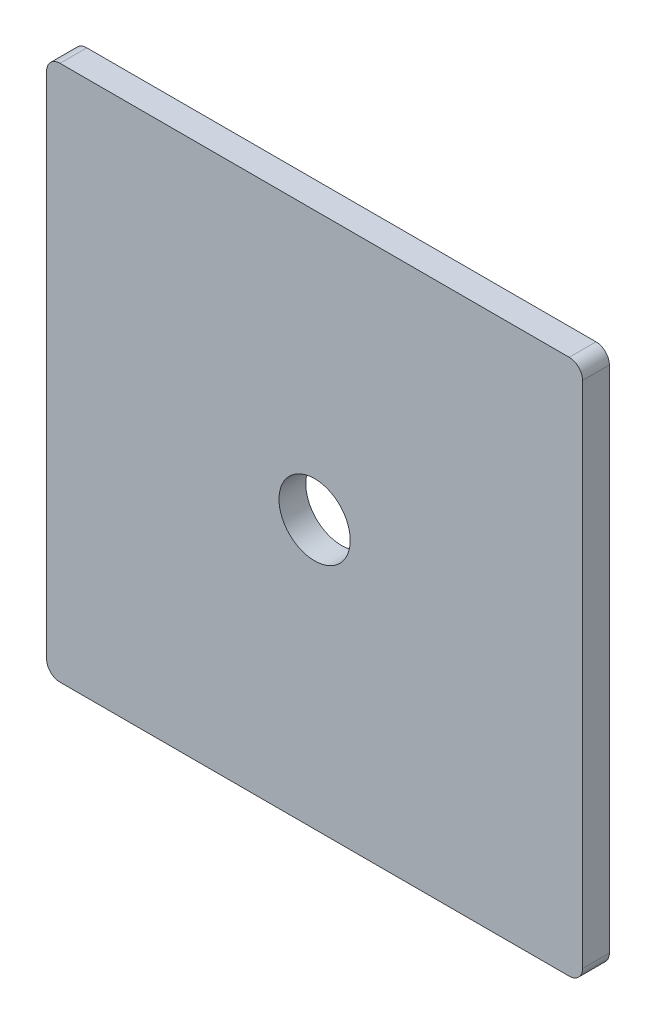
ISO-10303-21;
HEADER;
FILE_DESCRIPTION(('STEP AP214'),'2;1');
FILE_NAME('part.step','',(''),(''),'','','');
FILE_SCHEMA(('AUTOMOTIVE_DESIGN { 1 0 10303 214 1 1 1 1 }'));
ENDSEC;
DATA;
#1=APPLICATION_CONTEXT('core data for automotive mechanical design processes');
#2=APPLICATION_PROTOCOL_DEFINITION('international standard','automotive_design',2000,#1);
#3=PRODUCT_CONTEXT('',#1,'mechanical');
#4=PRODUCT('Part','Part','',(#3));
#5=PRODUCT_RELATED_PRODUCT_CATEGORY('part','',(#4));
#6=PRODUCT_DEFINITION_FORMATION('','',#4);
#7=PRODUCT_DEFINITION_CONTEXT('part definition',#1,'design');
#8=PRODUCT_DEFINITION('design','',#6,#7);
#9=PRODUCT_DEFINITION_SHAPE('','',#8);
#10=(LENGTH_UNIT() NAMED_UNIT(*) SI_UNIT(.MILLI.,.METRE.));
#11=(NAMED_UNIT(*) PLANE_ANGLE_UNIT() SI_UNIT($,.RADIAN.));
#12=(NAMED_UNIT(*) SI_UNIT($,.STERADIAN.) SOLID_ANGLE_UNIT());
#13=UNCERTAINTY_MEASURE_WITH_UNIT(LENGTH_MEASURE(1.E-05),#10,'distance_accuracy_value','');
#14=(GEOMETRIC_REPRESENTATION_CONTEXT(3) GLOBAL_UNCERTAINTY_ASSIGNED_CONTEXT((#13)) GLOBAL_UNIT_ASSIGNED_CONTEXT((#10,
#11,#12)) REPRESENTATION_CONTEXT('',''));
#15=CARTESIAN_POINT('',(0.,0.,0.));
#16=DIRECTION('',(0.,0.,1.));
#17=DIRECTION('',(1.,0.,0.));
#18=AXIS2_PLACEMENT_3D('',#15,#16,#17);
#19=CARTESIAN_POINT('',(2.85,-2.85,3.45));
#20=DIRECTION('',(0.,0.,-1.));
#21=DIRECTION('',(-1.,0.,0.));
#22=AXIS2_PLACEMENT_3D('',#19,#20,#21);
#23=CYLINDRICAL_SURFACE('',#22,0.15);
#24=CARTESIAN_POINT('',(2.85,-2.85,3.15));
#25=DIRECTION('',(0.,0.,-1.));
#26=DIRECTION('',(-1.,0.,0.));
#27=AXIS2_PLACEMENT_3D('',#24,#25,#26);
#28=CIRCLE('',#27,0.15);
#29=CARTESIAN_POINT('',(3.,-2.85,3.15));
#30=VERTEX_POINT('',#29);
#31=CARTESIAN_POINT('',(2.85,-3.,3.15));
#32=VERTEX_POINT('',#31);
#33=EDGE_CURVE('E134',#30,#32,#28,.T.);
#34=ORIENTED_EDGE('',*,*,#33,.F.);
#35=DIRECTION('',(0.,0.,-1.));
#36=VECTOR('',#35,1.);
#37=CARTESIAN_POINT('',(3.,-2.85,3.45));
#38=LINE('',#37,#36);
#39=CARTESIAN_POINT('',(3.,-2.85,3.45));
#40=VERTEX_POINT('',#39);
#41=EDGE_CURVE('E11',#40,#30,#38,.T.);
#42=ORIENTED_EDGE('',*,*,#41,.F.);
#43=CARTESIAN_POINT('',(2.85,-2.85,3.45));
#44=DIRECTION('',(0.,0.,-1.));
#45=DIRECTION('',(-1.,0.,0.));
#46=AXIS2_PLACEMENT_3D('',#43,#44,#45);
#47=CIRCLE('',#46,0.15);
#48=CARTESIAN_POINT('',(2.85,-3.,3.45));
#49=VERTEX_POINT('',#48);
#50=EDGE_CURVE('E154',#40,#49,#47,.T.);
#51=ORIENTED_EDGE('',*,*,#50,.T.);
#52=DIRECTION('',(0.,0.,-1.));
#53=VECTOR('',#52,1.);
#54=CARTESIAN_POINT('',(2.85,-3.,3.45));
#55=LINE('',#54,#53);
#56=EDGE_CURVE('E92',#49,#32,#55,.T.);
#57=ORIENTED_EDGE('',*,*,#56,.T.);
#58=EDGE_LOOP('',(#34,#42,#51,#57));
#59=FACE_BOUND('',#58,.T.);
#60=ADVANCED_FACE('F36',(#59),#23,.T.);
#61=CARTESIAN_POINT('',(3.,2.85,3.45));
#62=DIRECTION('',(1.,0.,0.));
#63=DIRECTION('',(0.,0.,-1.));
#64=AXIS2_PLACEMENT_3D('',#61,#62,#63);
#65=PLANE('',#64);
#66=DIRECTION('',(0.,-1.,0.));
#67=VECTOR('',#66,1.);
#68=CARTESIAN_POINT('',(3.,2.85,3.15));
#69=LINE('',#68,#67);
#70=CARTESIAN_POINT('',(3.,2.85,3.15));
#71=VERTEX_POINT('',#70);
#72=EDGE_CURVE('E152',#71,#30,#69,.T.);
#73=ORIENTED_EDGE('',*,*,#72,.F.);
#74=DIRECTION('',(0.,0.,-1.));
#75=VECTOR('',#74,1.);
#76=CARTESIAN_POINT('',(3.,2.85,3.45));
#77=LINE('',#76,#75);
#78=CARTESIAN_POINT('',(3.,2.85,3.45));
#79=VERTEX_POINT('',#78);
#80=EDGE_CURVE('E45',#79,#71,#77,.T.);
#81=ORIENTED_EDGE('',*,*,#80,.F.);
#82=DIRECTION('',(0.,-1.,0.));
#83=VECTOR('',#82,1.);
#84=CARTESIAN_POINT('',(3.,2.85,3.45));
#85=LINE('',#84,#83);
#86=EDGE_CURVE('E124',#79,#40,#85,.T.);
#87=ORIENTED_EDGE('',*,*,#86,.T.);
#88=ORIENTED_EDGE('',*,*,#41,.T.);
#89=EDGE_LOOP('',(#73,#81,#87,#88));
#90=FACE_BOUND('',#89,.T.);
#91=ADVANCED_FACE('F167',(#90),#65,.T.);
#92=CARTESIAN_POINT('',(2.85,2.85,3.45));
#93=DIRECTION('',(0.,0.,-1.));
#94=DIRECTION('',(-1.,0.,0.));
#95=AXIS2_PLACEMENT_3D('',#92,#93,#94);
#96=CYLINDRICAL_SURFACE('',#95,0.15);
#97=CARTESIAN_POINT('',(2.85,2.85,3.15));
#98=DIRECTION('',(0.,0.,-1.));
#99=DIRECTION('',(-1.,0.,0.));
#100=AXIS2_PLACEMENT_3D('',#97,#98,#99);
#101=CIRCLE('',#100,0.15);
#102=CARTESIAN_POINT('',(2.85,3.,3.15));
#103=VERTEX_POINT('',#102);
#104=EDGE_CURVE('E111',#103,#71,#101,.T.);
#105=ORIENTED_EDGE('',*,*,#104,.F.);
#106=DIRECTION('',(0.,0.,-1.));
#107=VECTOR('',#106,1.);
#108=CARTESIAN_POINT('',(2.85,3.,3.45));
#109=LINE('',#108,#107);
#110=CARTESIAN_POINT('',(2.85,3.,3.45));
#111=VERTEX_POINT('',#110);
#112=EDGE_CURVE('E106',#111,#103,#109,.T.);
#113=ORIENTED_EDGE('',*,*,#112,.F.);
#114=CARTESIAN_POINT('',(2.85,2.85,3.45));
#115=DIRECTION('',(0.,0.,-1.));
#116=DIRECTION('',(-1.,0.,0.));
#117=AXIS2_PLACEMENT_3D('',#114,#115,#116);
#118=CIRCLE('',#117,0.15);
#119=EDGE_CURVE('E109',#111,#79,#118,.T.);
#120=ORIENTED_EDGE('',*,*,#119,.T.);
#121=ORIENTED_EDGE('',*,*,#80,.T.);
#122=EDGE_LOOP('',(#105,#113,#120,#121));
#123=FACE_BOUND('',#122,.T.);
#124=ADVANCED_FACE('F108',(#123),#96,.T.);
#125=CARTESIAN_POINT('',(-2.85,3.,3.45));
#126=DIRECTION('',(0.,1.,0.));
#127=DIRECTION('',(0.,0.,1.));
#128=AXIS2_PLACEMENT_3D('',#125,#126,#127);
#129=PLANE('',#128);
#130=DIRECTION('',(1.,0.,0.));
#131=VECTOR('',#130,1.);
#132=CARTESIAN_POINT('',(-2.85,3.,3.15));
#133=LINE('',#132,#131);
#134=CARTESIAN_POINT('',(-2.85,3.,3.15));
#135=VERTEX_POINT('',#134);
#136=EDGE_CURVE('E149',#135,#103,#133,.T.);
#137=ORIENTED_EDGE('',*,*,#136,.F.);
#138=DIRECTION('',(0.,0.,-1.));
#139=VECTOR('',#138,1.);
#140=CARTESIAN_POINT('',(-2.85,3.,3.45));
#141=LINE('',#140,#139);
#142=CARTESIAN_POINT('',(-2.85,3.,3.45));
#143=VERTEX_POINT('',#142);
#144=EDGE_CURVE('E116',#143,#135,#141,.T.);
#145=ORIENTED_EDGE('',*,*,#144,.F.);
#146=DIRECTION('',(1.,0.,0.));
#147=VECTOR('',#146,1.);
#148=CARTESIAN_POINT('',(-2.85,3.,3.45));
#149=LINE('',#148,#147);
#150=EDGE_CURVE('E122',#143,#111,#149,.T.);
#151=ORIENTED_EDGE('',*,*,#150,.T.);
#152=ORIENTED_EDGE('',*,*,#112,.T.);
#153=EDGE_LOOP('',(#137,#145,#151,#152));
#154=FACE_BOUND('',#153,.T.);
#155=ADVANCED_FACE('F126',(#154),#129,.T.);
#156=CARTESIAN_POINT('',(-2.85,2.85,3.45));
#157=DIRECTION('',(0.,0.,-1.));
#158=DIRECTION('',(-1.,0.,0.));
#159=AXIS2_PLACEMENT_3D('',#156,#157,#158);
#160=CYLINDRICAL_SURFACE('',#159,0.15);
#161=CARTESIAN_POINT('',(-2.85,2.85,3.15));
#162=DIRECTION('',(0.,0.,-1.));
#163=DIRECTION('',(-1.,0.,0.));
#164=AXIS2_PLACEMENT_3D('',#161,#162,#163);
#165=CIRCLE('',#164,0.15);
#166=CARTESIAN_POINT('',(-3.,2.85,3.15));
#167=VERTEX_POINT('',#166);
#168=EDGE_CURVE('E146',#167,#135,#165,.T.);
#169=ORIENTED_EDGE('',*,*,#168,.F.);
#170=DIRECTION('',(0.,0.,-1.));
#171=VECTOR('',#170,1.);
#172=CARTESIAN_POINT('',(-3.,2.85,3.45));
#173=LINE('',#172,#171);
#174=CARTESIAN_POINT('',(-3.,2.85,3.45));
#175=VERTEX_POINT('',#174);
#176=EDGE_CURVE('E158',#175,#167,#173,.T.);
#177=ORIENTED_EDGE('',*,*,#176,.F.);
#178=CARTESIAN_POINT('',(-2.85,2.85,3.45));
#179=DIRECTION('',(0.,0.,-1.));
#180=DIRECTION('',(-1.,0.,0.));
#181=AXIS2_PLACEMENT_3D('',#178,#179,#180);
#182=CIRCLE('',#181,0.15);
#183=EDGE_CURVE('E127',#175,#143,#182,.T.);
#184=ORIENTED_EDGE('',*,*,#183,.T.);
#185=ORIENTED_EDGE('',*,*,#144,.T.);
#186=EDGE_LOOP('',(#169,#177,#184,#185));
#187=FACE_BOUND('',#186,.T.);
#188=ADVANCED_FACE('F180',(#187),#160,.T.);
#189=CARTESIAN_POINT('',(-3.,-2.85,3.45));
#190=DIRECTION('',(-1.,0.,0.));
#191=DIRECTION('',(0.,0.,1.));
#192=AXIS2_PLACEMENT_3D('',#189,#190,#191);
#193=PLANE('',#192);
#194=DIRECTION('',(0.,1.,0.));
#195=VECTOR('',#194,1.);
#196=CARTESIAN_POINT('',(-3.,-2.85,3.15));
#197=LINE('',#196,#195);
#198=CARTESIAN_POINT('',(-3.,-2.85,3.15));
#199=VERTEX_POINT('',#198);
#200=EDGE_CURVE('E143',#199,#167,#197,.T.);
#201=ORIENTED_EDGE('',*,*,#200,.F.);
#202=DIRECTION('',(0.,0.,-1.));
#203=VECTOR('',#202,1.);
#204=CARTESIAN_POINT('',(-3.,-2.85,3.45));
#205=LINE('',#204,#203);
#206=CARTESIAN_POINT('',(-3.,-2.85,3.45));
#207=VERTEX_POINT('',#206);
#208=EDGE_CURVE('E160',#207,#199,#205,.T.);
#209=ORIENTED_EDGE('',*,*,#208,.F.);
#210=DIRECTION('',(0.,1.,0.));
#211=VECTOR('',#210,1.);
#212=CARTESIAN_POINT('',(-3.,-2.85,3.45));
#213=LINE('',#212,#211);
#214=EDGE_CURVE('E129',#207,#175,#213,.T.);
#215=ORIENTED_EDGE('',*,*,#214,.T.);
#216=ORIENTED_EDGE('',*,*,#176,.T.);
#217=EDGE_LOOP('',(#201,#209,#215,#216));
#218=FACE_BOUND('',#217,.T.);
#219=ADVANCED_FACE('F183',(#218),#193,.T.);
#220=CARTESIAN_POINT('',(-2.85,-2.85,3.45));
#221=DIRECTION('',(0.,0.,-1.));
#222=DIRECTION('',(-1.,0.,0.));
#223=AXIS2_PLACEMENT_3D('',#220,#221,#222);
#224=CYLINDRICAL_SURFACE('',#223,0.15);
#225=CARTESIAN_POINT('',(-2.85,-2.85,3.15));
#226=DIRECTION('',(0.,0.,-1.));
#227=DIRECTION('',(-1.,0.,0.));
#228=AXIS2_PLACEMENT_3D('',#225,#226,#227);
#229=CIRCLE('',#228,0.15);
#230=CARTESIAN_POINT('',(-2.85,-3.,3.15));
#231=VERTEX_POINT('',#230);
#232=EDGE_CURVE('E140',#231,#199,#229,.T.);
#233=ORIENTED_EDGE('',*,*,#232,.F.);
#234=DIRECTION('',(0.,0.,-1.));
#235=VECTOR('',#234,1.);
#236=CARTESIAN_POINT('',(-2.85,-3.,3.45));
#237=LINE('',#236,#235);
#238=CARTESIAN_POINT('',(-2.85,-3.,3.45));
#239=VERTEX_POINT('',#238);
#240=EDGE_CURVE('E162',#239,#231,#237,.T.);
#241=ORIENTED_EDGE('',*,*,#240,.F.);
#242=CARTESIAN_POINT('',(-2.85,-2.85,3.45));
#243=DIRECTION('',(0.,0.,-1.));
#244=DIRECTION('',(-1.,0.,0.));
#245=AXIS2_PLACEMENT_3D('',#242,#243,#244);
#246=CIRCLE('',#245,0.15);
#247=EDGE_CURVE('E217',#239,#207,#246,.T.);
#248=ORIENTED_EDGE('',*,*,#247,.T.);
#249=ORIENTED_EDGE('',*,*,#208,.T.);
#250=EDGE_LOOP('',(#233,#241,#248,#249));
#251=FACE_BOUND('',#250,.T.);
#252=ADVANCED_FACE('F187',(#251),#224,.T.);
#253=CARTESIAN_POINT('',(2.85,-3.,3.45));
#254=DIRECTION('',(0.,-1.,0.));
#255=DIRECTION('',(0.,0.,-1.));
#256=AXIS2_PLACEMENT_3D('',#253,#254,#255);
#257=PLANE('',#256);
#258=DIRECTION('',(-1.,0.,0.));
#259=VECTOR('',#258,1.);
#260=CARTESIAN_POINT('',(2.85,-3.,3.15));
#261=LINE('',#260,#259);
#262=EDGE_CURVE('E137',#32,#231,#261,.T.);
#263=ORIENTED_EDGE('',*,*,#262,.F.);
#264=ORIENTED_EDGE('',*,*,#56,.F.);
#265=DIRECTION('',(-1.,0.,0.));
#266=VECTOR('',#265,1.);
#267=CARTESIAN_POINT('',(2.85,-3.,3.45));
#268=LINE('',#267,#266);
#269=EDGE_CURVE('E215',#49,#239,#268,.T.);
#270=ORIENTED_EDGE('',*,*,#269,.T.);
#271=ORIENTED_EDGE('',*,*,#240,.T.);
#272=EDGE_LOOP('',(#263,#264,#270,#271));
#273=FACE_BOUND('',#272,.T.);
#274=ADVANCED_FACE('F163',(#273),#257,.T.);
#275=CARTESIAN_POINT('',(2.85,-2.85,3.45));
#276=DIRECTION('',(0.,0.,-1.));
#277=DIRECTION('',(-1.,0.,0.));
#278=AXIS2_PLACEMENT_3D('',#275,#276,#277);
#279=PLANE('',#278);
#280=CARTESIAN_POINT('',(0.,0.,3.45));
#281=DIRECTION('',(0.,0.,1.));
#282=DIRECTION('',(1.,0.,0.));
#283=AXIS2_PLACEMENT_3D('',#280,#281,#282);
#284=CIRCLE('',#283,0.39883196395356);
#285=CARTESIAN_POINT('',(0.39883196395356,0.,3.45));
#286=VERTEX_POINT('',#285);
#287=EDGE_CURVE('E211',#286,#286,#284,.T.);
#288=ORIENTED_EDGE('',*,*,#287,.F.);
#289=EDGE_LOOP('',(#288));
#290=FACE_BOUND('',#289,.T.);
#291=ORIENTED_EDGE('',*,*,#50,.F.);
#292=ORIENTED_EDGE('',*,*,#86,.F.);
#293=ORIENTED_EDGE('',*,*,#119,.F.);
#294=ORIENTED_EDGE('',*,*,#150,.F.);
#295=ORIENTED_EDGE('',*,*,#183,.F.);
#296=ORIENTED_EDGE('',*,*,#214,.F.);
#297=ORIENTED_EDGE('',*,*,#247,.F.);
#298=ORIENTED_EDGE('',*,*,#269,.F.);
#299=EDGE_LOOP('',(#291,#292,#293,#294,#295,#296,#297,#298));
#300=FACE_BOUND('',#299,.T.);
#301=ADVANCED_FACE('F120',(#290,#300),#279,.F.);
#302=CARTESIAN_POINT('',(2.85,-2.85,3.15));
#303=DIRECTION('',(0.,0.,-1.));
#304=DIRECTION('',(-1.,0.,0.));
#305=AXIS2_PLACEMENT_3D('',#302,#303,#304);
#306=PLANE('',#305);
#307=CARTESIAN_POINT('',(0.,0.,3.15));
#308=DIRECTION('',(0.,0.,-1.));
#309=DIRECTION('',(-1.,0.,0.));
#310=AXIS2_PLACEMENT_3D('',#307,#308,#309);
#311=CIRCLE('',#310,0.39883196395356);
#312=CARTESIAN_POINT('',(-0.39883196395356,0.,3.15));
#313=VERTEX_POINT('',#312);
#314=EDGE_CURVE('E39',#313,#313,#311,.T.);
#315=ORIENTED_EDGE('',*,*,#314,.F.);
#316=EDGE_LOOP('',(#315));
#317=FACE_BOUND('',#316,.T.);
#318=ORIENTED_EDGE('',*,*,#33,.T.);
#319=ORIENTED_EDGE('',*,*,#262,.T.);
#320=ORIENTED_EDGE('',*,*,#232,.T.);
#321=ORIENTED_EDGE('',*,*,#200,.T.);
#322=ORIENTED_EDGE('',*,*,#168,.T.);
#323=ORIENTED_EDGE('',*,*,#136,.T.);
#324=ORIENTED_EDGE('',*,*,#104,.T.);
#325=ORIENTED_EDGE('',*,*,#72,.T.);
#326=EDGE_LOOP('',(#318,#319,#320,#321,#322,#323,#324,#325));
#327=FACE_BOUND('',#326,.T.);
#328=ADVANCED_FACE('F166',(#317,#327),#306,.T.);
#329=CARTESIAN_POINT('',(0.,0.,-6.55));
#330=DIRECTION('',(0.,0.,1.));
#331=DIRECTION('',(1.,0.,0.));
#332=AXIS2_PLACEMENT_3D('',#329,#330,#331);
#333=CYLINDRICAL_SURFACE('',#332,0.39883196395356);
#334=ORIENTED_EDGE('',*,*,#314,.T.);
#335=EDGE_LOOP('',(#334));
#336=FACE_BOUND('',#335,.T.);
#337=ORIENTED_EDGE('',*,*,#287,.T.);
#338=EDGE_LOOP('',(#337));
#339=FACE_BOUND('',#338,.T.);
#340=ADVANCED_FACE('F199',(#336,#339),#333,.F.);
#341=CLOSED_SHELL('',(#60,#91,#124,#155,#188,#219,#252,#274,#301,#328,#340));
#342=MANIFOLD_SOLID_BREP('B2',#341);
#343=ADVANCED_BREP_SHAPE_REPRESENTATION('',(#18,#342),#14);
#344=SHAPE_DEFINITION_REPRESENTATION(#9,#343);
ENDSEC;
END-ISO-10303-21;
